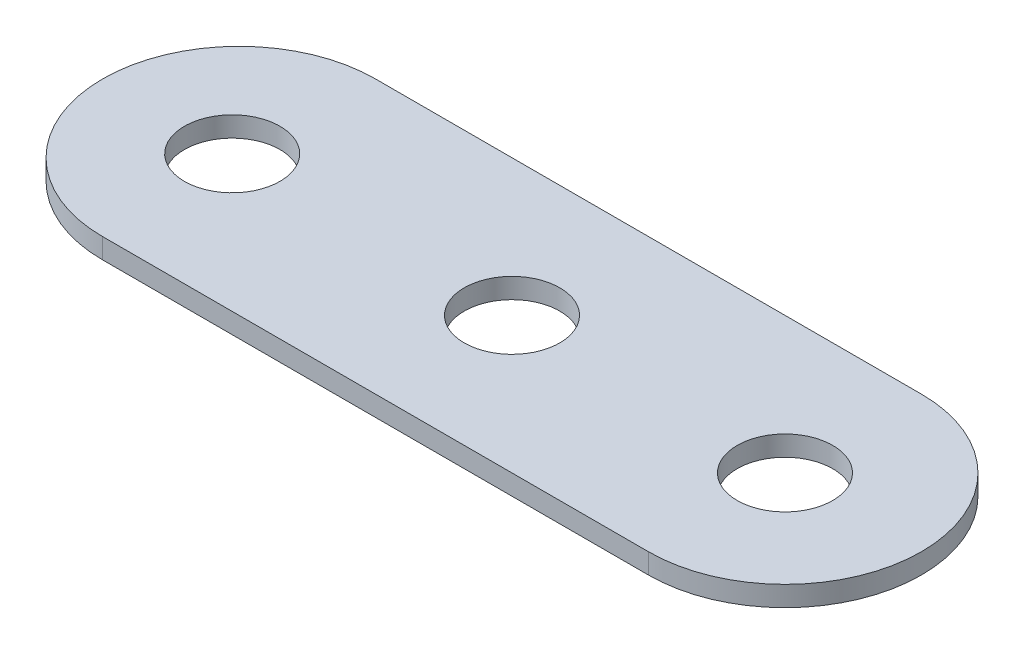
ISO-10303-21;
HEADER;
FILE_DESCRIPTION(('STEP AP214'),'2;1');
FILE_NAME('part.step','',(''),(''),'','','');
FILE_SCHEMA(('AUTOMOTIVE_DESIGN { 1 0 10303 214 1 1 1 1 }'));
ENDSEC;
DATA;
#1=APPLICATION_CONTEXT('core data for automotive mechanical design processes');
#2=APPLICATION_PROTOCOL_DEFINITION('international standard','automotive_design',2000,#1);
#3=PRODUCT_CONTEXT('',#1,'mechanical');
#4=PRODUCT('Part','Part','',(#3));
#5=PRODUCT_RELATED_PRODUCT_CATEGORY('part','',(#4));
#6=PRODUCT_DEFINITION_FORMATION('','',#4);
#7=PRODUCT_DEFINITION_CONTEXT('part definition',#1,'design');
#8=PRODUCT_DEFINITION('design','',#6,#7);
#9=PRODUCT_DEFINITION_SHAPE('','',#8);
#10=(LENGTH_UNIT() NAMED_UNIT(*) SI_UNIT(.MILLI.,.METRE.));
#11=(NAMED_UNIT(*) PLANE_ANGLE_UNIT() SI_UNIT($,.RADIAN.));
#12=(NAMED_UNIT(*) SI_UNIT($,.STERADIAN.) SOLID_ANGLE_UNIT());
#13=UNCERTAINTY_MEASURE_WITH_UNIT(LENGTH_MEASURE(1.E-05),#10,'distance_accuracy_value','');
#14=(GEOMETRIC_REPRESENTATION_CONTEXT(3) GLOBAL_UNCERTAINTY_ASSIGNED_CONTEXT((#13)) GLOBAL_UNIT_ASSIGNED_CONTEXT((#10,
#11,#12)) REPRESENTATION_CONTEXT('',''));
#15=CARTESIAN_POINT('',(0.,0.,0.));
#16=DIRECTION('',(0.,0.,1.));
#17=DIRECTION('',(1.,0.,0.));
#18=AXIS2_PLACEMENT_3D('',#15,#16,#17);
#19=CARTESIAN_POINT('',(-37.465,0.9398,0.));
#20=DIRECTION('',(0.,-1.,0.));
#21=DIRECTION('',(0.,0.,-1.));
#22=AXIS2_PLACEMENT_3D('',#19,#20,#21);
#23=CYLINDRICAL_SURFACE('',#22,6.35);
#24=CARTESIAN_POINT('',(-37.465,0.,0.));
#25=DIRECTION('',(0.,1.,0.));
#26=DIRECTION('',(0.,0.,1.));
#27=AXIS2_PLACEMENT_3D('',#24,#25,#26);
#28=CIRCLE('',#27,6.35);
#29=CARTESIAN_POINT('',(-37.465,0.,-6.35));
#30=VERTEX_POINT('',#29);
#31=CARTESIAN_POINT('',(-37.465,0.,6.35));
#32=VERTEX_POINT('',#31);
#33=EDGE_CURVE('E113',#30,#32,#28,.F.);
#34=ORIENTED_EDGE('',*,*,#33,.F.);
#35=DIRECTION('',(0.,-1.,0.));
#36=VECTOR('',#35,1.);
#37=CARTESIAN_POINT('',(-37.465,0.9398,-6.35));
#38=LINE('',#37,#36);
#39=CARTESIAN_POINT('',(-37.465,0.9398,-6.35));
#40=VERTEX_POINT('',#39);
#41=EDGE_CURVE('E11',#40,#30,#38,.T.);
#42=ORIENTED_EDGE('',*,*,#41,.F.);
#43=CARTESIAN_POINT('',(-37.465,0.9398,0.));
#44=DIRECTION('',(0.,1.,0.));
#45=DIRECTION('',(0.,0.,1.));
#46=AXIS2_PLACEMENT_3D('',#43,#44,#45);
#47=CIRCLE('',#46,6.35);
#48=CARTESIAN_POINT('',(-37.465,0.9398,6.35));
#49=VERTEX_POINT('',#48);
#50=EDGE_CURVE('E97',#40,#49,#47,.F.);
#51=ORIENTED_EDGE('',*,*,#50,.T.);
#52=DIRECTION('',(0.,-1.,0.));
#53=VECTOR('',#52,1.);
#54=CARTESIAN_POINT('',(-37.465,0.9398,6.35));
#55=LINE('',#54,#53);
#56=EDGE_CURVE('E76',#49,#32,#55,.T.);
#57=ORIENTED_EDGE('',*,*,#56,.T.);
#58=EDGE_LOOP('',(#34,#42,#51,#57));
#59=FACE_BOUND('',#58,.T.);
#60=ADVANCED_FACE('F36',(#59),#23,.T.);
#61=CARTESIAN_POINT('',(0.,0.9398,-6.35));
#62=DIRECTION('',(0.,0.,-1.));
#63=DIRECTION('',(-1.,0.,0.));
#64=AXIS2_PLACEMENT_3D('',#61,#62,#63);
#65=PLANE('',#64);
#66=DIRECTION('',(1.,0.,0.));
#67=VECTOR('',#66,1.);
#68=CARTESIAN_POINT('',(0.,0.,-6.35));
#69=LINE('',#68,#67);
#70=CARTESIAN_POINT('',(-62.865,0.,-6.35));
#71=VERTEX_POINT('',#70);
#72=EDGE_CURVE('E88',#71,#30,#69,.T.);
#73=ORIENTED_EDGE('',*,*,#72,.F.);
#74=DIRECTION('',(0.,-1.,0.));
#75=VECTOR('',#74,1.);
#76=CARTESIAN_POINT('',(-62.865,0.9398,-6.35));
#77=LINE('',#76,#75);
#78=CARTESIAN_POINT('',(-62.865,0.9398,-6.35));
#79=VERTEX_POINT('',#78);
#80=EDGE_CURVE('E45',#79,#71,#77,.T.);
#81=ORIENTED_EDGE('',*,*,#80,.F.);
#82=DIRECTION('',(1.,0.,0.));
#83=VECTOR('',#82,1.);
#84=CARTESIAN_POINT('',(0.,0.9398,-6.35));
#85=LINE('',#84,#83);
#86=EDGE_CURVE('E86',#79,#40,#85,.T.);
#87=ORIENTED_EDGE('',*,*,#86,.T.);
#88=ORIENTED_EDGE('',*,*,#41,.T.);
#89=EDGE_LOOP('',(#73,#81,#87,#88));
#90=FACE_BOUND('',#89,.T.);
#91=ADVANCED_FACE('F84',(#90),#65,.T.);
#92=CARTESIAN_POINT('',(-62.865,0.9398,0.));
#93=DIRECTION('',(0.,-1.,0.));
#94=DIRECTION('',(0.,0.,-1.));
#95=AXIS2_PLACEMENT_3D('',#92,#93,#94);
#96=CYLINDRICAL_SURFACE('',#95,6.35);
#97=CARTESIAN_POINT('',(-62.865,0.,0.));
#98=DIRECTION('',(0.,1.,0.));
#99=DIRECTION('',(0.,0.,1.));
#100=AXIS2_PLACEMENT_3D('',#97,#98,#99);
#101=CIRCLE('',#100,6.35);
#102=CARTESIAN_POINT('',(-62.865,0.,6.35));
#103=VERTEX_POINT('',#102);
#104=EDGE_CURVE('E116',#71,#103,#101,.T.);
#105=ORIENTED_EDGE('',*,*,#104,.T.);
#106=DIRECTION('',(0.,-1.,0.));
#107=VECTOR('',#106,1.);
#108=CARTESIAN_POINT('',(-62.865,0.9398,6.35));
#109=LINE('',#108,#107);
#110=CARTESIAN_POINT('',(-62.865,0.9398,6.35));
#111=VERTEX_POINT('',#110);
#112=EDGE_CURVE('E91',#111,#103,#109,.T.);
#113=ORIENTED_EDGE('',*,*,#112,.F.);
#114=CARTESIAN_POINT('',(-62.865,0.9398,0.));
#115=DIRECTION('',(0.,1.,0.));
#116=DIRECTION('',(0.,0.,1.));
#117=AXIS2_PLACEMENT_3D('',#114,#115,#116);
#118=CIRCLE('',#117,6.35);
#119=EDGE_CURVE('E93',#79,#111,#118,.T.);
#120=ORIENTED_EDGE('',*,*,#119,.F.);
#121=ORIENTED_EDGE('',*,*,#80,.T.);
#122=EDGE_LOOP('',(#105,#113,#120,#121));
#123=FACE_BOUND('',#122,.T.);
#124=ADVANCED_FACE('F94',(#123),#96,.T.);
#125=CARTESIAN_POINT('',(-37.465,0.9398,0.));
#126=DIRECTION('',(0.,-1.,0.));
#127=DIRECTION('',(0.,0.,-1.));
#128=AXIS2_PLACEMENT_3D('',#125,#126,#127);
#129=CYLINDRICAL_SURFACE('',#128,2.22249999999999);
#130=CARTESIAN_POINT('',(-37.465,0.9398,0.));
#131=DIRECTION('',(0.,1.,0.));
#132=DIRECTION('',(0.,0.,1.));
#133=AXIS2_PLACEMENT_3D('',#130,#131,#132);
#134=CIRCLE('',#133,2.22249999999999);
#135=CARTESIAN_POINT('',(-37.465,0.9398,2.22249999999999));
#136=VERTEX_POINT('',#135);
#137=EDGE_CURVE('E99',#136,#136,#134,.T.);
#138=ORIENTED_EDGE('',*,*,#137,.T.);
#139=EDGE_LOOP('',(#138));
#140=FACE_BOUND('',#139,.T.);
#141=CARTESIAN_POINT('',(-37.465,0.,0.));
#142=DIRECTION('',(0.,1.,0.));
#143=DIRECTION('',(0.,0.,1.));
#144=AXIS2_PLACEMENT_3D('',#141,#142,#143);
#145=CIRCLE('',#144,2.22249999999999);
#146=CARTESIAN_POINT('',(-37.465,0.,2.22249999999999));
#147=VERTEX_POINT('',#146);
#148=EDGE_CURVE('E110',#147,#147,#145,.T.);
#149=ORIENTED_EDGE('',*,*,#148,.F.);
#150=EDGE_LOOP('',(#149));
#151=FACE_BOUND('',#150,.T.);
#152=ADVANCED_FACE('F132',(#140,#151),#129,.F.);
#153=CARTESIAN_POINT('',(-63.1825,0.9398,0.));
#154=DIRECTION('',(0.,-1.,0.));
#155=DIRECTION('',(0.,0.,-1.));
#156=AXIS2_PLACEMENT_3D('',#153,#154,#155);
#157=CYLINDRICAL_SURFACE('',#156,2.2225);
#158=CARTESIAN_POINT('',(-63.1825,0.9398,0.));
#159=DIRECTION('',(0.,1.,0.));
#160=DIRECTION('',(0.,0.,1.));
#161=AXIS2_PLACEMENT_3D('',#158,#159,#160);
#162=CIRCLE('',#161,2.2225);
#163=CARTESIAN_POINT('',(-63.1825,0.9398,2.2225));
#164=VERTEX_POINT('',#163);
#165=EDGE_CURVE('E145',#164,#164,#162,.T.);
#166=ORIENTED_EDGE('',*,*,#165,.T.);
#167=EDGE_LOOP('',(#166));
#168=FACE_BOUND('',#167,.T.);
#169=CARTESIAN_POINT('',(-63.1825,0.,0.));
#170=DIRECTION('',(0.,1.,0.));
#171=DIRECTION('',(0.,0.,1.));
#172=AXIS2_PLACEMENT_3D('',#169,#170,#171);
#173=CIRCLE('',#172,2.2225);
#174=CARTESIAN_POINT('',(-63.1825,0.,2.2225));
#175=VERTEX_POINT('',#174);
#176=EDGE_CURVE('E107',#175,#175,#173,.T.);
#177=ORIENTED_EDGE('',*,*,#176,.F.);
#178=EDGE_LOOP('',(#177));
#179=FACE_BOUND('',#178,.T.);
#180=ADVANCED_FACE('F134',(#168,#179),#157,.F.);
#181=CARTESIAN_POINT('',(-50.165,0.9398,0.));
#182=DIRECTION('',(0.,-1.,0.));
#183=DIRECTION('',(0.,0.,-1.));
#184=AXIS2_PLACEMENT_3D('',#181,#182,#183);
#185=CYLINDRICAL_SURFACE('',#184,2.2225);
#186=CARTESIAN_POINT('',(-50.165,0.9398,0.));
#187=DIRECTION('',(0.,1.,0.));
#188=DIRECTION('',(0.,0.,1.));
#189=AXIS2_PLACEMENT_3D('',#186,#187,#188);
#190=CIRCLE('',#189,2.2225);
#191=CARTESIAN_POINT('',(-50.165,0.9398,2.2225));
#192=VERTEX_POINT('',#191);
#193=EDGE_CURVE('E119',#192,#192,#190,.T.);
#194=ORIENTED_EDGE('',*,*,#193,.T.);
#195=EDGE_LOOP('',(#194));
#196=FACE_BOUND('',#195,.T.);
#197=CARTESIAN_POINT('',(-50.165,0.,0.));
#198=DIRECTION('',(0.,1.,0.));
#199=DIRECTION('',(0.,0.,1.));
#200=AXIS2_PLACEMENT_3D('',#197,#198,#199);
#201=CIRCLE('',#200,2.2225);
#202=CARTESIAN_POINT('',(-50.165,0.,2.2225));
#203=VERTEX_POINT('',#202);
#204=EDGE_CURVE('E104',#203,#203,#201,.T.);
#205=ORIENTED_EDGE('',*,*,#204,.F.);
#206=EDGE_LOOP('',(#205));
#207=FACE_BOUND('',#206,.T.);
#208=ADVANCED_FACE('F38',(#196,#207),#185,.F.);
#209=CARTESIAN_POINT('',(0.,0.9398,6.35000000000001));
#210=DIRECTION('',(0.,0.,-1.));
#211=DIRECTION('',(-1.,0.,0.));
#212=AXIS2_PLACEMENT_3D('',#209,#210,#211);
#213=PLANE('',#212);
#214=DIRECTION('',(1.,0.,0.));
#215=VECTOR('',#214,1.);
#216=CARTESIAN_POINT('',(0.,0.,6.35000000000001));
#217=LINE('',#216,#215);
#218=EDGE_CURVE('E69',#103,#32,#217,.T.);
#219=ORIENTED_EDGE('',*,*,#218,.T.);
#220=ORIENTED_EDGE('',*,*,#56,.F.);
#221=DIRECTION('',(1.,0.,0.));
#222=VECTOR('',#221,1.);
#223=CARTESIAN_POINT('',(0.,0.9398,6.35000000000001));
#224=LINE('',#223,#222);
#225=EDGE_CURVE('E53',#111,#49,#224,.T.);
#226=ORIENTED_EDGE('',*,*,#225,.F.);
#227=ORIENTED_EDGE('',*,*,#112,.T.);
#228=EDGE_LOOP('',(#219,#220,#226,#227));
#229=FACE_BOUND('',#228,.T.);
#230=ADVANCED_FACE('F122',(#229),#213,.F.);
#231=CARTESIAN_POINT('',(0.,0.9398,0.));
#232=DIRECTION('',(0.,1.,0.));
#233=DIRECTION('',(0.,0.,1.));
#234=AXIS2_PLACEMENT_3D('',#231,#232,#233);
#235=PLANE('',#234);
#236=ORIENTED_EDGE('',*,*,#193,.F.);
#237=EDGE_LOOP('',(#236));
#238=FACE_BOUND('',#237,.T.);
#239=ORIENTED_EDGE('',*,*,#165,.F.);
#240=EDGE_LOOP('',(#239));
#241=FACE_BOUND('',#240,.T.);
#242=ORIENTED_EDGE('',*,*,#137,.F.);
#243=EDGE_LOOP('',(#242));
#244=FACE_BOUND('',#243,.T.);
#245=ORIENTED_EDGE('',*,*,#50,.F.);
#246=ORIENTED_EDGE('',*,*,#86,.F.);
#247=ORIENTED_EDGE('',*,*,#119,.T.);
#248=ORIENTED_EDGE('',*,*,#225,.T.);
#249=EDGE_LOOP('',(#245,#246,#247,#248));
#250=FACE_BOUND('',#249,.T.);
#251=ADVANCED_FACE('F96',(#238,#241,#244,#250),#235,.T.);
#252=CARTESIAN_POINT('',(0.,0.,0.));
#253=DIRECTION('',(0.,1.,0.));
#254=DIRECTION('',(0.,0.,1.));
#255=AXIS2_PLACEMENT_3D('',#252,#253,#254);
#256=PLANE('',#255);
#257=ORIENTED_EDGE('',*,*,#204,.T.);
#258=EDGE_LOOP('',(#257));
#259=FACE_BOUND('',#258,.T.);
#260=ORIENTED_EDGE('',*,*,#176,.T.);
#261=EDGE_LOOP('',(#260));
#262=FACE_BOUND('',#261,.T.);
#263=ORIENTED_EDGE('',*,*,#148,.T.);
#264=EDGE_LOOP('',(#263));
#265=FACE_BOUND('',#264,.T.);
#266=ORIENTED_EDGE('',*,*,#33,.T.);
#267=ORIENTED_EDGE('',*,*,#218,.F.);
#268=ORIENTED_EDGE('',*,*,#104,.F.);
#269=ORIENTED_EDGE('',*,*,#72,.T.);
#270=EDGE_LOOP('',(#266,#267,#268,#269));
#271=FACE_BOUND('',#270,.T.);
#272=ADVANCED_FACE('F123',(#259,#262,#265,#271),#256,.F.);
#273=CLOSED_SHELL('',(#60,#91,#124,#152,#180,#208,#230,#251,#272));
#274=MANIFOLD_SOLID_BREP('B2',#273);
#275=ADVANCED_BREP_SHAPE_REPRESENTATION('',(#18,#274),#14);
#276=SHAPE_DEFINITION_REPRESENTATION(#9,#275);
ENDSEC;
END-ISO-10303-21;
